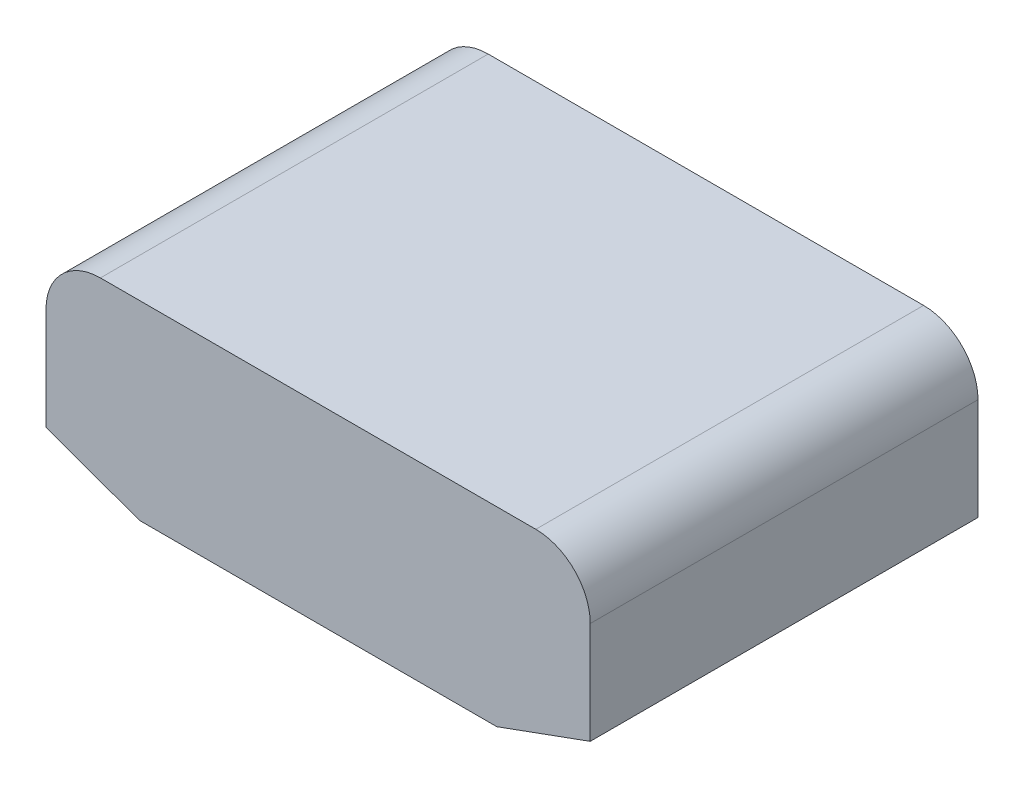
ISO-10303-21;
HEADER;
FILE_DESCRIPTION(('STEP AP214'),'2;1');
FILE_NAME('part.step','',(''),(''),'','','');
FILE_SCHEMA(('AUTOMOTIVE_DESIGN { 1 0 10303 214 1 1 1 1 }'));
ENDSEC;
DATA;
#1=APPLICATION_CONTEXT('core data for automotive mechanical design processes');
#2=APPLICATION_PROTOCOL_DEFINITION('international standard','automotive_design',2000,#1);
#3=PRODUCT_CONTEXT('',#1,'mechanical');
#4=PRODUCT('Part','Part','',(#3));
#5=PRODUCT_RELATED_PRODUCT_CATEGORY('part','',(#4));
#6=PRODUCT_DEFINITION_FORMATION('','',#4);
#7=PRODUCT_DEFINITION_CONTEXT('part definition',#1,'design');
#8=PRODUCT_DEFINITION('design','',#6,#7);
#9=PRODUCT_DEFINITION_SHAPE('','',#8);
#10=(LENGTH_UNIT() NAMED_UNIT(*) SI_UNIT(.MILLI.,.METRE.));
#11=(NAMED_UNIT(*) PLANE_ANGLE_UNIT() SI_UNIT($,.RADIAN.));
#12=(NAMED_UNIT(*) SI_UNIT($,.STERADIAN.) SOLID_ANGLE_UNIT());
#13=UNCERTAINTY_MEASURE_WITH_UNIT(LENGTH_MEASURE(1.E-05),#10,'distance_accuracy_value','');
#14=(GEOMETRIC_REPRESENTATION_CONTEXT(3) GLOBAL_UNCERTAINTY_ASSIGNED_CONTEXT((#13)) GLOBAL_UNIT_ASSIGNED_CONTEXT((#10,
#11,#12)) REPRESENTATION_CONTEXT('',''));
#15=CARTESIAN_POINT('',(0.,0.,0.));
#16=DIRECTION('',(0.,0.,1.));
#17=DIRECTION('',(1.,0.,0.));
#18=AXIS2_PLACEMENT_3D('',#15,#16,#17);
#19=CARTESIAN_POINT('',(0.,2.8,5.7));
#20=DIRECTION('',(0.,1.,0.));
#21=DIRECTION('',(0.,0.,1.));
#22=AXIS2_PLACEMENT_3D('',#19,#20,#21);
#23=PLANE('',#22);
#24=DIRECTION('',(1.,0.,0.));
#25=VECTOR('',#24,1.);
#26=CARTESIAN_POINT('',(0.,2.8,0.));
#27=LINE('',#26,#25);
#28=CARTESIAN_POINT('',(-6.48915328347895,2.8,0.));
#29=VERTEX_POINT('',#28);
#30=CARTESIAN_POINT('',(-0.0891532834789464,2.8,0.));
#31=VERTEX_POINT('',#30);
#32=EDGE_CURVE('E260',#29,#31,#27,.T.);
#33=ORIENTED_EDGE('',*,*,#32,.F.);
#34=DIRECTION('',(0.,0.,-1.));
#35=VECTOR('',#34,1.);
#36=CARTESIAN_POINT('',(-6.48915328347895,2.8,5.7));
#37=LINE('',#36,#35);
#38=CARTESIAN_POINT('',(-6.48915328347895,2.8,5.7));
#39=VERTEX_POINT('',#38);
#40=EDGE_CURVE('E307',#29,#39,#37,.F.);
#41=ORIENTED_EDGE('',*,*,#40,.T.);
#42=DIRECTION('',(1.,0.,0.));
#43=VECTOR('',#42,1.);
#44=CARTESIAN_POINT('',(0.,2.8,5.7));
#45=LINE('',#44,#43);
#46=CARTESIAN_POINT('',(-0.0891532834789464,2.8,5.7));
#47=VERTEX_POINT('',#46);
#48=EDGE_CURVE('E274',#39,#47,#45,.T.);
#49=ORIENTED_EDGE('',*,*,#48,.T.);
#50=DIRECTION('',(0.,0.,-1.));
#51=VECTOR('',#50,1.);
#52=CARTESIAN_POINT('',(-0.0891532834789464,2.8,5.7));
#53=LINE('',#52,#51);
#54=EDGE_CURVE('E304',#47,#31,#53,.T.);
#55=ORIENTED_EDGE('',*,*,#54,.T.);
#56=EDGE_LOOP('',(#33,#41,#49,#55));
#57=FACE_BOUND('',#56,.T.);
#58=ADVANCED_FACE('F34',(#57),#23,.T.);
#59=CARTESIAN_POINT('',(-7.28915328347895,0.,5.7));
#60=DIRECTION('',(1.,0.,0.));
#61=DIRECTION('',(0.,0.,-1.));
#62=AXIS2_PLACEMENT_3D('',#59,#60,#61);
#63=PLANE('',#62);
#64=DIRECTION('',(0.,-1.,0.));
#65=VECTOR('',#64,1.);
#66=CARTESIAN_POINT('',(-7.28915328347895,0.,0.));
#67=LINE('',#66,#65);
#68=CARTESIAN_POINT('',(-7.28915328347895,2.,0.));
#69=VERTEX_POINT('',#68);
#70=CARTESIAN_POINT('',(-7.28915328347895,0.5,0.));
#71=VERTEX_POINT('',#70);
#72=EDGE_CURVE('E290',#69,#71,#67,.T.);
#73=ORIENTED_EDGE('',*,*,#72,.T.);
#74=DIRECTION('',(0.,0.,1.));
#75=VECTOR('',#74,1.);
#76=CARTESIAN_POINT('',(-7.28915328347895,0.5,5.7));
#77=LINE('',#76,#75);
#78=CARTESIAN_POINT('',(-7.28915328347895,0.5,5.7));
#79=VERTEX_POINT('',#78);
#80=EDGE_CURVE('E11',#71,#79,#77,.T.);
#81=ORIENTED_EDGE('',*,*,#80,.T.);
#82=DIRECTION('',(0.,-1.,0.));
#83=VECTOR('',#82,1.);
#84=CARTESIAN_POINT('',(-7.28915328347895,0.,5.7));
#85=LINE('',#84,#83);
#86=CARTESIAN_POINT('',(-7.28915328347895,2.,5.7));
#87=VERTEX_POINT('',#86);
#88=EDGE_CURVE('E277',#87,#79,#85,.T.);
#89=ORIENTED_EDGE('',*,*,#88,.F.);
#90=DIRECTION('',(0.,0.,-1.));
#91=VECTOR('',#90,1.);
#92=CARTESIAN_POINT('',(-7.28915328347895,2.,0.));
#93=LINE('',#92,#91);
#94=EDGE_CURVE('E287',#87,#69,#93,.T.);
#95=ORIENTED_EDGE('',*,*,#94,.T.);
#96=EDGE_LOOP('',(#73,#81,#89,#95));
#97=FACE_BOUND('',#96,.T.);
#98=ADVANCED_FACE('F353',(#97),#63,.F.);
#99=CARTESIAN_POINT('',(0.,0.,5.7));
#100=DIRECTION('',(0.,-1.,0.));
#101=DIRECTION('',(1.,0.,0.));
#102=AXIS2_PLACEMENT_3D('',#99,#100,#101);
#103=PLANE('',#102);
#104=DIRECTION('',(-1.,0.,0.));
#105=VECTOR('',#104,1.);
#106=CARTESIAN_POINT('',(0.,0.,0.));
#107=LINE('',#106,#105);
#108=CARTESIAN_POINT('',(-0.662891993206257,0.,0.));
#109=VERTEX_POINT('',#108);
#110=CARTESIAN_POINT('',(-5.91541457375164,0.,0.));
#111=VERTEX_POINT('',#110);
#112=EDGE_CURVE('E293',#109,#111,#107,.T.);
#113=ORIENTED_EDGE('',*,*,#112,.F.);
#114=DIRECTION('',(0.,0.,1.));
#115=VECTOR('',#114,1.);
#116=CARTESIAN_POINT('',(-0.662891993206257,0.,5.7));
#117=LINE('',#116,#115);
#118=CARTESIAN_POINT('',(-0.662891993206257,0.,5.7));
#119=VERTEX_POINT('',#118);
#120=EDGE_CURVE('E325',#109,#119,#117,.T.);
#121=ORIENTED_EDGE('',*,*,#120,.T.);
#122=DIRECTION('',(-1.,0.,0.));
#123=VECTOR('',#122,1.);
#124=CARTESIAN_POINT('',(0.,0.,5.7));
#125=LINE('',#124,#123);
#126=CARTESIAN_POINT('',(-5.91541457375164,0.,5.7));
#127=VERTEX_POINT('',#126);
#128=EDGE_CURVE('E281',#119,#127,#125,.T.);
#129=ORIENTED_EDGE('',*,*,#128,.T.);
#130=DIRECTION('',(0.,0.,-1.));
#131=VECTOR('',#130,1.);
#132=CARTESIAN_POINT('',(-5.91541457375164,0.,0.));
#133=LINE('',#132,#131);
#134=EDGE_CURVE('E322',#127,#111,#133,.T.);
#135=ORIENTED_EDGE('',*,*,#134,.T.);
#136=EDGE_LOOP('',(#113,#121,#129,#135));
#137=FACE_BOUND('',#136,.T.);
#138=ADVANCED_FACE('F346',(#137),#103,.T.);
#139=CARTESIAN_POINT('',(0.710846716521054,0.,5.7));
#140=DIRECTION('',(1.,0.,0.));
#141=DIRECTION('',(0.,0.,-1.));
#142=AXIS2_PLACEMENT_3D('',#139,#140,#141);
#143=PLANE('',#142);
#144=DIRECTION('',(0.,-1.,0.));
#145=VECTOR('',#144,1.);
#146=CARTESIAN_POINT('',(0.710846716521054,0.,5.7));
#147=LINE('',#146,#145);
#148=CARTESIAN_POINT('',(0.710846716521054,2.,5.7));
#149=VERTEX_POINT('',#148);
#150=CARTESIAN_POINT('',(0.710846716521054,0.500000000000002,5.7));
#151=VERTEX_POINT('',#150);
#152=EDGE_CURVE('E284',#149,#151,#147,.T.);
#153=ORIENTED_EDGE('',*,*,#152,.T.);
#154=DIRECTION('',(0.,0.,-1.));
#155=VECTOR('',#154,1.);
#156=CARTESIAN_POINT('',(0.710846716521054,0.500000000000002,5.7));
#157=LINE('',#156,#155);
#158=CARTESIAN_POINT('',(0.710846716521054,0.500000000000002,0.));
#159=VERTEX_POINT('',#158);
#160=EDGE_CURVE('E315',#151,#159,#157,.T.);
#161=ORIENTED_EDGE('',*,*,#160,.T.);
#162=DIRECTION('',(0.,-1.,0.));
#163=VECTOR('',#162,1.);
#164=CARTESIAN_POINT('',(0.710846716521054,0.,0.));
#165=LINE('',#164,#163);
#166=CARTESIAN_POINT('',(0.710846716521054,2.,0.));
#167=VERTEX_POINT('',#166);
#168=EDGE_CURVE('E278',#167,#159,#165,.T.);
#169=ORIENTED_EDGE('',*,*,#168,.F.);
#170=DIRECTION('',(0.,0.,-1.));
#171=VECTOR('',#170,1.);
#172=CARTESIAN_POINT('',(0.710846716521054,2.,5.7));
#173=LINE('',#172,#171);
#174=EDGE_CURVE('E313',#167,#149,#173,.F.);
#175=ORIENTED_EDGE('',*,*,#174,.T.);
#176=EDGE_LOOP('',(#153,#161,#169,#175));
#177=FACE_BOUND('',#176,.T.);
#178=ADVANCED_FACE('F338',(#177),#143,.T.);
#179=CARTESIAN_POINT('',(0.,0.,5.7));
#180=DIRECTION('',(0.,0.,1.));
#181=DIRECTION('',(1.,0.,0.));
#182=AXIS2_PLACEMENT_3D('',#179,#180,#181);
#183=PLANE('',#182);
#184=ORIENTED_EDGE('',*,*,#128,.F.);
#185=DIRECTION('',(-0.939692620785908,-0.34202014332567,0.));
#186=VECTOR('',#185,1.);
#187=CARTESIAN_POINT('',(-0.0775436327112707,0.213049379896698,5.7));
#188=LINE('',#187,#186);
#189=EDGE_CURVE('E42',#119,#151,#188,.F.);
#190=ORIENTED_EDGE('',*,*,#189,.T.);
#191=ORIENTED_EDGE('',*,*,#152,.F.);
#192=CARTESIAN_POINT('',(-0.0891532834789464,2.,5.7));
#193=DIRECTION('',(0.,0.,1.));
#194=DIRECTION('',(1.,0.,0.));
#195=AXIS2_PLACEMENT_3D('',#192,#193,#194);
#196=CIRCLE('',#195,0.8);
#197=EDGE_CURVE('E309',#149,#47,#196,.T.);
#198=ORIENTED_EDGE('',*,*,#197,.T.);
#199=ORIENTED_EDGE('',*,*,#48,.F.);
#200=CARTESIAN_POINT('',(-6.48915328347895,2.,5.7));
#201=DIRECTION('',(0.,0.,1.));
#202=DIRECTION('',(1.,0.,0.));
#203=AXIS2_PLACEMENT_3D('',#200,#201,#202);
#204=CIRCLE('',#203,0.8);
#205=EDGE_CURVE('E311',#39,#87,#204,.T.);
#206=ORIENTED_EDGE('',*,*,#205,.T.);
#207=ORIENTED_EDGE('',*,*,#88,.T.);
#208=DIRECTION('',(0.939692620785908,-0.342020143325669,0.));
#209=VECTOR('',#208,1.);
#210=CARTESIAN_POINT('',(-0.691972055392091,-1.90117759708337,5.7));
#211=LINE('',#210,#209);
#212=EDGE_CURVE('E327',#79,#127,#211,.T.);
#213=ORIENTED_EDGE('',*,*,#212,.T.);
#214=EDGE_LOOP('',(#184,#190,#191,#198,#199,#206,#207,#213));
#215=FACE_BOUND('',#214,.T.);
#216=ADVANCED_FACE('F332',(#215),#183,.T.);
#217=CARTESIAN_POINT('',(0.,0.,0.));
#218=DIRECTION('',(0.,0.,1.));
#219=DIRECTION('',(1.,0.,0.));
#220=AXIS2_PLACEMENT_3D('',#217,#218,#219);
#221=PLANE('',#220);
#222=DIRECTION('',(0.,-1.,0.));
#223=VECTOR('',#222,1.);
#224=CARTESIAN_POINT('',(0.310846716521054,2.,0.));
#225=LINE('',#224,#223);
#226=CARTESIAN_POINT('',(0.310846716521054,2.,0.));
#227=VERTEX_POINT('',#226);
#228=CARTESIAN_POINT('',(0.310846716521054,0.780083015283885,0.));
#229=VERTEX_POINT('',#228);
#230=EDGE_CURVE('E238',#227,#229,#225,.T.);
#231=ORIENTED_EDGE('',*,*,#230,.F.);
#232=CARTESIAN_POINT('',(-0.0891532834789464,2.,0.));
#233=DIRECTION('',(0.,0.,-1.));
#234=DIRECTION('',(-1.,0.,0.));
#235=AXIS2_PLACEMENT_3D('',#232,#233,#234);
#236=CIRCLE('',#235,0.4);
#237=CARTESIAN_POINT('',(-0.0891532834789485,2.4,0.));
#238=VERTEX_POINT('',#237);
#239=EDGE_CURVE('E49',#238,#227,#236,.T.);
#240=ORIENTED_EDGE('',*,*,#239,.F.);
#241=DIRECTION('',(1.,0.,0.));
#242=VECTOR('',#241,1.);
#243=CARTESIAN_POINT('',(-6.48915328347895,2.4,0.));
#244=LINE('',#243,#242);
#245=CARTESIAN_POINT('',(-6.48915328347895,2.4,0.));
#246=VERTEX_POINT('',#245);
#247=EDGE_CURVE('E215',#246,#238,#244,.T.);
#248=ORIENTED_EDGE('',*,*,#247,.F.);
#249=CARTESIAN_POINT('',(-6.48915328347895,2.,0.));
#250=DIRECTION('',(0.,0.,-1.));
#251=DIRECTION('',(-1.,0.,0.));
#252=AXIS2_PLACEMENT_3D('',#249,#250,#251);
#253=CIRCLE('',#252,0.4);
#254=CARTESIAN_POINT('',(-6.88915328347895,2.,0.));
#255=VERTEX_POINT('',#254);
#256=EDGE_CURVE('E253',#255,#246,#253,.T.);
#257=ORIENTED_EDGE('',*,*,#256,.F.);
#258=DIRECTION('',(0.,1.,0.));
#259=VECTOR('',#258,1.);
#260=CARTESIAN_POINT('',(-6.88915328347895,0.780083015283883,0.));
#261=LINE('',#260,#259);
#262=CARTESIAN_POINT('',(-6.88915328347895,0.780083015283883,0.));
#263=VERTEX_POINT('',#262);
#264=EDGE_CURVE('E250',#263,#255,#261,.T.);
#265=ORIENTED_EDGE('',*,*,#264,.F.);
#266=DIRECTION('',(-0.939692620785908,0.342020143325669,0.));
#267=VECTOR('',#266,1.);
#268=CARTESIAN_POINT('',(-5.84488378146825,0.399999999999999,0.));
#269=LINE('',#268,#267);
#270=CARTESIAN_POINT('',(-5.84488378146825,0.399999999999999,0.));
#271=VERTEX_POINT('',#270);
#272=EDGE_CURVE('E247',#271,#263,#269,.T.);
#273=ORIENTED_EDGE('',*,*,#272,.F.);
#274=DIRECTION('',(-1.,0.,0.));
#275=VECTOR('',#274,1.);
#276=CARTESIAN_POINT('',(-0.733422785489644,0.4,0.));
#277=LINE('',#276,#275);
#278=CARTESIAN_POINT('',(-0.733422785489644,0.4,0.));
#279=VERTEX_POINT('',#278);
#280=EDGE_CURVE('E244',#279,#271,#277,.T.);
#281=ORIENTED_EDGE('',*,*,#280,.F.);
#282=DIRECTION('',(-0.939692620785908,-0.34202014332567,0.));
#283=VECTOR('',#282,1.);
#284=CARTESIAN_POINT('',(0.310846716521054,0.780083015283885,0.));
#285=LINE('',#284,#283);
#286=EDGE_CURVE('E241',#229,#279,#285,.T.);
#287=ORIENTED_EDGE('',*,*,#286,.F.);
#288=EDGE_LOOP('',(#231,#240,#248,#257,#265,#273,#281,#287));
#289=FACE_BOUND('',#288,.T.);
#290=ORIENTED_EDGE('',*,*,#168,.T.);
#291=DIRECTION('',(0.939692620785908,0.34202014332567,0.));
#292=VECTOR('',#291,1.);
#293=CARTESIAN_POINT('',(0.710846716521054,0.500000000000002,0.));
#294=LINE('',#293,#292);
#295=EDGE_CURVE('E320',#159,#109,#294,.F.);
#296=ORIENTED_EDGE('',*,*,#295,.T.);
#297=ORIENTED_EDGE('',*,*,#112,.T.);
#298=DIRECTION('',(-0.939692620785908,0.342020143325669,0.));
#299=VECTOR('',#298,1.);
#300=CARTESIAN_POINT('',(-5.91541457375164,0.,0.));
#301=LINE('',#300,#299);
#302=EDGE_CURVE('E318',#111,#71,#301,.T.);
#303=ORIENTED_EDGE('',*,*,#302,.T.);
#304=ORIENTED_EDGE('',*,*,#72,.F.);
#305=CARTESIAN_POINT('',(-6.48915328347895,2.,0.));
#306=DIRECTION('',(0.,0.,1.));
#307=DIRECTION('',(1.,0.,0.));
#308=AXIS2_PLACEMENT_3D('',#305,#306,#307);
#309=CIRCLE('',#308,0.8);
#310=EDGE_CURVE('E302',#69,#29,#309,.F.);
#311=ORIENTED_EDGE('',*,*,#310,.T.);
#312=ORIENTED_EDGE('',*,*,#32,.T.);
#313=CARTESIAN_POINT('',(-0.0891532834789464,2.,0.));
#314=DIRECTION('',(0.,0.,1.));
#315=DIRECTION('',(1.,0.,0.));
#316=AXIS2_PLACEMENT_3D('',#313,#314,#315);
#317=CIRCLE('',#316,0.8);
#318=EDGE_CURVE('E300',#31,#167,#317,.F.);
#319=ORIENTED_EDGE('',*,*,#318,.T.);
#320=EDGE_LOOP('',(#290,#296,#297,#303,#304,#311,#312,#319));
#321=FACE_BOUND('',#320,.T.);
#322=ADVANCED_FACE('F344',(#289,#321),#221,.F.);
#323=CARTESIAN_POINT('',(-6.48915328347895,2.,5.7));
#324=DIRECTION('',(0.,0.,1.));
#325=DIRECTION('',(1.,0.,0.));
#326=AXIS2_PLACEMENT_3D('',#323,#324,#325);
#327=CYLINDRICAL_SURFACE('',#326,0.8);
#328=ORIENTED_EDGE('',*,*,#205,.F.);
#329=ORIENTED_EDGE('',*,*,#40,.F.);
#330=ORIENTED_EDGE('',*,*,#310,.F.);
#331=ORIENTED_EDGE('',*,*,#94,.F.);
#332=EDGE_LOOP('',(#328,#329,#330,#331));
#333=FACE_BOUND('',#332,.T.);
#334=ADVANCED_FACE('F358',(#333),#327,.T.);
#335=CARTESIAN_POINT('',(-0.0891532834789464,2.,5.7));
#336=DIRECTION('',(0.,0.,-1.));
#337=DIRECTION('',(-1.,0.,0.));
#338=AXIS2_PLACEMENT_3D('',#335,#336,#337);
#339=CYLINDRICAL_SURFACE('',#338,0.8);
#340=ORIENTED_EDGE('',*,*,#197,.F.);
#341=ORIENTED_EDGE('',*,*,#174,.F.);
#342=ORIENTED_EDGE('',*,*,#318,.F.);
#343=ORIENTED_EDGE('',*,*,#54,.F.);
#344=EDGE_LOOP('',(#340,#341,#342,#343));
#345=FACE_BOUND('',#344,.T.);
#346=ADVANCED_FACE('F365',(#345),#339,.T.);
#347=CARTESIAN_POINT('',(0.710846716521054,0.500000000000002,5.7));
#348=DIRECTION('',(-0.34202014332567,0.939692620785908,0.));
#349=DIRECTION('',(0.,0.,-1.));
#350=AXIS2_PLACEMENT_3D('',#347,#348,#349);
#351=PLANE('',#350);
#352=ORIENTED_EDGE('',*,*,#189,.F.);
#353=ORIENTED_EDGE('',*,*,#120,.F.);
#354=ORIENTED_EDGE('',*,*,#295,.F.);
#355=ORIENTED_EDGE('',*,*,#160,.F.);
#356=EDGE_LOOP('',(#352,#353,#354,#355));
#357=FACE_BOUND('',#356,.T.);
#358=ADVANCED_FACE('F341',(#357),#351,.F.);
#359=CARTESIAN_POINT('',(-5.91541457375164,0.,5.7));
#360=DIRECTION('',(-0.342020143325669,-0.939692620785908,0.));
#361=DIRECTION('',(0.,0.,1.));
#362=AXIS2_PLACEMENT_3D('',#359,#360,#361);
#363=PLANE('',#362);
#364=ORIENTED_EDGE('',*,*,#212,.F.);
#365=ORIENTED_EDGE('',*,*,#80,.F.);
#366=ORIENTED_EDGE('',*,*,#302,.F.);
#367=ORIENTED_EDGE('',*,*,#134,.F.);
#368=EDGE_LOOP('',(#364,#365,#366,#367));
#369=FACE_BOUND('',#368,.T.);
#370=ADVANCED_FACE('F36',(#369),#363,.T.);
#371=CARTESIAN_POINT('',(-0.0891532834789464,2.,5.));
#372=DIRECTION('',(0.,0.,-1.));
#373=DIRECTION('',(-1.,0.,0.));
#374=AXIS2_PLACEMENT_3D('',#371,#372,#373);
#375=CYLINDRICAL_SURFACE('',#374,0.4);
#376=ORIENTED_EDGE('',*,*,#239,.T.);
#377=DIRECTION('',(0.,0.,-1.));
#378=VECTOR('',#377,1.);
#379=CARTESIAN_POINT('',(0.310846716521054,2.,5.));
#380=LINE('',#379,#378);
#381=CARTESIAN_POINT('',(0.310846716521054,2.,5.));
#382=VERTEX_POINT('',#381);
#383=EDGE_CURVE('E236',#382,#227,#380,.T.);
#384=ORIENTED_EDGE('',*,*,#383,.F.);
#385=CARTESIAN_POINT('',(-0.0891532834789464,2.,5.));
#386=DIRECTION('',(0.,0.,-1.));
#387=DIRECTION('',(-1.,0.,0.));
#388=AXIS2_PLACEMENT_3D('',#385,#386,#387);
#389=CIRCLE('',#388,0.4);
#390=CARTESIAN_POINT('',(-0.0891532834789485,2.4,5.));
#391=VERTEX_POINT('',#390);
#392=EDGE_CURVE('E211',#391,#382,#389,.T.);
#393=ORIENTED_EDGE('',*,*,#392,.F.);
#394=DIRECTION('',(0.,0.,-1.));
#395=VECTOR('',#394,1.);
#396=CARTESIAN_POINT('',(-0.0891532834789485,2.4,5.));
#397=LINE('',#396,#395);
#398=EDGE_CURVE('E258',#391,#238,#397,.T.);
#399=ORIENTED_EDGE('',*,*,#398,.T.);
#400=EDGE_LOOP('',(#376,#384,#393,#399));
#401=FACE_BOUND('',#400,.T.);
#402=ADVANCED_FACE('F390',(#401),#375,.F.);
#403=CARTESIAN_POINT('',(-6.48915328347895,2.4,5.));
#404=DIRECTION('',(0.,1.,0.));
#405=DIRECTION('',(0.,0.,1.));
#406=AXIS2_PLACEMENT_3D('',#403,#404,#405);
#407=PLANE('',#406);
#408=ORIENTED_EDGE('',*,*,#247,.T.);
#409=ORIENTED_EDGE('',*,*,#398,.F.);
#410=DIRECTION('',(1.,0.,0.));
#411=VECTOR('',#410,1.);
#412=CARTESIAN_POINT('',(-6.48915328347895,2.4,5.));
#413=LINE('',#412,#411);
#414=CARTESIAN_POINT('',(-6.48915328347895,2.4,5.));
#415=VERTEX_POINT('',#414);
#416=EDGE_CURVE('E233',#415,#391,#413,.T.);
#417=ORIENTED_EDGE('',*,*,#416,.F.);
#418=DIRECTION('',(0.,0.,-1.));
#419=VECTOR('',#418,1.);
#420=CARTESIAN_POINT('',(-6.48915328347895,2.4,5.));
#421=LINE('',#420,#419);
#422=EDGE_CURVE('E261',#415,#246,#421,.T.);
#423=ORIENTED_EDGE('',*,*,#422,.T.);
#424=EDGE_LOOP('',(#408,#409,#417,#423));
#425=FACE_BOUND('',#424,.T.);
#426=ADVANCED_FACE('F393',(#425),#407,.F.);
#427=CARTESIAN_POINT('',(-6.48915328347895,2.,5.));
#428=DIRECTION('',(0.,0.,-1.));
#429=DIRECTION('',(-1.,0.,0.));
#430=AXIS2_PLACEMENT_3D('',#427,#428,#429);
#431=CYLINDRICAL_SURFACE('',#430,0.4);
#432=ORIENTED_EDGE('',*,*,#256,.T.);
#433=ORIENTED_EDGE('',*,*,#422,.F.);
#434=CARTESIAN_POINT('',(-6.48915328347895,2.,5.));
#435=DIRECTION('',(0.,0.,-1.));
#436=DIRECTION('',(-1.,0.,0.));
#437=AXIS2_PLACEMENT_3D('',#434,#435,#436);
#438=CIRCLE('',#437,0.4);
#439=CARTESIAN_POINT('',(-6.88915328347895,2.,5.));
#440=VERTEX_POINT('',#439);
#441=EDGE_CURVE('E230',#440,#415,#438,.T.);
#442=ORIENTED_EDGE('',*,*,#441,.F.);
#443=DIRECTION('',(0.,0.,-1.));
#444=VECTOR('',#443,1.);
#445=CARTESIAN_POINT('',(-6.88915328347895,2.,5.));
#446=LINE('',#445,#444);
#447=EDGE_CURVE('E263',#440,#255,#446,.T.);
#448=ORIENTED_EDGE('',*,*,#447,.T.);
#449=EDGE_LOOP('',(#432,#433,#442,#448));
#450=FACE_BOUND('',#449,.T.);
#451=ADVANCED_FACE('F413',(#450),#431,.F.);
#452=CARTESIAN_POINT('',(-6.88915328347895,0.780083015283883,5.));
#453=DIRECTION('',(-1.,0.,0.));
#454=DIRECTION('',(0.,0.,1.));
#455=AXIS2_PLACEMENT_3D('',#452,#453,#454);
#456=PLANE('',#455);
#457=ORIENTED_EDGE('',*,*,#264,.T.);
#458=ORIENTED_EDGE('',*,*,#447,.F.);
#459=DIRECTION('',(0.,1.,0.));
#460=VECTOR('',#459,1.);
#461=CARTESIAN_POINT('',(-6.88915328347895,0.780083015283883,5.));
#462=LINE('',#461,#460);
#463=CARTESIAN_POINT('',(-6.88915328347895,0.780083015283883,5.));
#464=VERTEX_POINT('',#463);
#465=EDGE_CURVE('E227',#464,#440,#462,.T.);
#466=ORIENTED_EDGE('',*,*,#465,.F.);
#467=DIRECTION('',(0.,0.,-1.));
#468=VECTOR('',#467,1.);
#469=CARTESIAN_POINT('',(-6.88915328347895,0.780083015283883,5.));
#470=LINE('',#469,#468);
#471=EDGE_CURVE('E265',#464,#263,#470,.T.);
#472=ORIENTED_EDGE('',*,*,#471,.T.);
#473=EDGE_LOOP('',(#457,#458,#466,#472));
#474=FACE_BOUND('',#473,.T.);
#475=ADVANCED_FACE('F409',(#474),#456,.F.);
#476=CARTESIAN_POINT('',(-5.84488378146825,0.399999999999999,5.));
#477=DIRECTION('',(-0.342020143325669,-0.939692620785908,0.));
#478=DIRECTION('',(0.939692620785908,-0.342020143325669,0.));
#479=AXIS2_PLACEMENT_3D('',#476,#477,#478);
#480=PLANE('',#479);
#481=ORIENTED_EDGE('',*,*,#272,.T.);
#482=ORIENTED_EDGE('',*,*,#471,.F.);
#483=DIRECTION('',(-0.939692620785908,0.342020143325669,0.));
#484=VECTOR('',#483,1.);
#485=CARTESIAN_POINT('',(-5.84488378146825,0.399999999999999,5.));
#486=LINE('',#485,#484);
#487=CARTESIAN_POINT('',(-5.84488378146825,0.399999999999999,5.));
#488=VERTEX_POINT('',#487);
#489=EDGE_CURVE('E224',#488,#464,#486,.T.);
#490=ORIENTED_EDGE('',*,*,#489,.F.);
#491=DIRECTION('',(0.,0.,-1.));
#492=VECTOR('',#491,1.);
#493=CARTESIAN_POINT('',(-5.84488378146825,0.399999999999999,5.));
#494=LINE('',#493,#492);
#495=EDGE_CURVE('E267',#488,#271,#494,.T.);
#496=ORIENTED_EDGE('',*,*,#495,.T.);
#497=EDGE_LOOP('',(#481,#482,#490,#496));
#498=FACE_BOUND('',#497,.T.);
#499=ADVANCED_FACE('F405',(#498),#480,.F.);
#500=CARTESIAN_POINT('',(-0.733422785489644,0.4,5.));
#501=DIRECTION('',(0.,-1.,0.));
#502=DIRECTION('',(1.,0.,0.));
#503=AXIS2_PLACEMENT_3D('',#500,#501,#502);
#504=PLANE('',#503);
#505=ORIENTED_EDGE('',*,*,#280,.T.);
#506=ORIENTED_EDGE('',*,*,#495,.F.);
#507=DIRECTION('',(-1.,0.,0.));
#508=VECTOR('',#507,1.);
#509=CARTESIAN_POINT('',(-0.733422785489644,0.4,5.));
#510=LINE('',#509,#508);
#511=CARTESIAN_POINT('',(-0.733422785489644,0.4,5.));
#512=VERTEX_POINT('',#511);
#513=EDGE_CURVE('E221',#512,#488,#510,.T.);
#514=ORIENTED_EDGE('',*,*,#513,.F.);
#515=DIRECTION('',(0.,0.,-1.));
#516=VECTOR('',#515,1.);
#517=CARTESIAN_POINT('',(-0.733422785489644,0.4,5.));
#518=LINE('',#517,#516);
#519=EDGE_CURVE('E269',#512,#279,#518,.T.);
#520=ORIENTED_EDGE('',*,*,#519,.T.);
#521=EDGE_LOOP('',(#505,#506,#514,#520));
#522=FACE_BOUND('',#521,.T.);
#523=ADVANCED_FACE('F401',(#522),#504,.F.);
#524=CARTESIAN_POINT('',(0.310846716521054,0.780083015283885,5.));
#525=DIRECTION('',(0.34202014332567,-0.939692620785908,0.));
#526=DIRECTION('',(0.939692620785908,0.34202014332567,0.));
#527=AXIS2_PLACEMENT_3D('',#524,#525,#526);
#528=PLANE('',#527);
#529=ORIENTED_EDGE('',*,*,#286,.T.);
#530=ORIENTED_EDGE('',*,*,#519,.F.);
#531=DIRECTION('',(-0.939692620785908,-0.34202014332567,0.));
#532=VECTOR('',#531,1.);
#533=CARTESIAN_POINT('',(0.310846716521054,0.780083015283885,5.));
#534=LINE('',#533,#532);
#535=CARTESIAN_POINT('',(0.310846716521054,0.780083015283885,5.));
#536=VERTEX_POINT('',#535);
#537=EDGE_CURVE('E218',#536,#512,#534,.T.);
#538=ORIENTED_EDGE('',*,*,#537,.F.);
#539=DIRECTION('',(0.,0.,-1.));
#540=VECTOR('',#539,1.);
#541=CARTESIAN_POINT('',(0.310846716521054,0.780083015283885,5.));
#542=LINE('',#541,#540);
#543=EDGE_CURVE('E271',#536,#229,#542,.T.);
#544=ORIENTED_EDGE('',*,*,#543,.T.);
#545=EDGE_LOOP('',(#529,#530,#538,#544));
#546=FACE_BOUND('',#545,.T.);
#547=ADVANCED_FACE('F397',(#546),#528,.F.);
#548=CARTESIAN_POINT('',(0.310846716521054,2.,5.));
#549=DIRECTION('',(1.,0.,0.));
#550=DIRECTION('',(0.,0.,-1.));
#551=AXIS2_PLACEMENT_3D('',#548,#549,#550);
#552=PLANE('',#551);
#553=ORIENTED_EDGE('',*,*,#230,.T.);
#554=ORIENTED_EDGE('',*,*,#543,.F.);
#555=DIRECTION('',(0.,-1.,0.));
#556=VECTOR('',#555,1.);
#557=CARTESIAN_POINT('',(0.310846716521054,2.,5.));
#558=LINE('',#557,#556);
#559=EDGE_CURVE('E214',#382,#536,#558,.T.);
#560=ORIENTED_EDGE('',*,*,#559,.F.);
#561=ORIENTED_EDGE('',*,*,#383,.T.);
#562=EDGE_LOOP('',(#553,#554,#560,#561));
#563=FACE_BOUND('',#562,.T.);
#564=ADVANCED_FACE('F394',(#563),#552,.F.);
#565=CARTESIAN_POINT('',(-0.0891532834789464,2.,5.));
#566=DIRECTION('',(0.,0.,-1.));
#567=DIRECTION('',(-1.,0.,0.));
#568=AXIS2_PLACEMENT_3D('',#565,#566,#567);
#569=PLANE('',#568);
#570=DIRECTION('',(-1.,0.,0.));
#571=VECTOR('',#570,1.);
#572=CARTESIAN_POINT('',(-5.84488378146825,1.11944980492851,5.));
#573=LINE('',#572,#571);
#574=CARTESIAN_POINT('',(-1.14398976985797,1.11944980492851,5.));
#575=VERTEX_POINT('',#574);
#576=CARTESIAN_POINT('',(-5.84488378146825,1.11944980492851,5.));
#577=VERTEX_POINT('',#576);
#578=EDGE_CURVE('E182',#575,#577,#573,.T.);
#579=ORIENTED_EDGE('',*,*,#578,.F.);
#580=DIRECTION('',(0.,-1.,0.));
#581=VECTOR('',#580,1.);
#582=CARTESIAN_POINT('',(-1.14398976985797,1.73122073521448,5.));
#583=LINE('',#582,#581);
#584=CARTESIAN_POINT('',(-1.14398976985797,1.73122073521448,5.));
#585=VERTEX_POINT('',#584);
#586=EDGE_CURVE('E192',#585,#575,#583,.T.);
#587=ORIENTED_EDGE('',*,*,#586,.F.);
#588=DIRECTION('',(1.,0.,0.));
#589=VECTOR('',#588,1.);
#590=CARTESIAN_POINT('',(-5.84488378146825,1.73122073521448,5.));
#591=LINE('',#590,#589);
#592=CARTESIAN_POINT('',(-5.84488378146825,1.73122073521448,5.));
#593=VERTEX_POINT('',#592);
#594=EDGE_CURVE('E174',#593,#585,#591,.T.);
#595=ORIENTED_EDGE('',*,*,#594,.F.);
#596=DIRECTION('',(0.,1.,0.));
#597=VECTOR('',#596,1.);
#598=CARTESIAN_POINT('',(-5.84488378146825,1.73122073521448,5.));
#599=LINE('',#598,#597);
#600=EDGE_CURVE('E189',#577,#593,#599,.T.);
#601=ORIENTED_EDGE('',*,*,#600,.F.);
#602=EDGE_LOOP('',(#579,#587,#595,#601));
#603=FACE_BOUND('',#602,.T.);
#604=ORIENTED_EDGE('',*,*,#392,.T.);
#605=ORIENTED_EDGE('',*,*,#559,.T.);
#606=ORIENTED_EDGE('',*,*,#537,.T.);
#607=ORIENTED_EDGE('',*,*,#513,.T.);
#608=ORIENTED_EDGE('',*,*,#489,.T.);
#609=ORIENTED_EDGE('',*,*,#465,.T.);
#610=ORIENTED_EDGE('',*,*,#441,.T.);
#611=ORIENTED_EDGE('',*,*,#416,.T.);
#612=EDGE_LOOP('',(#604,#605,#606,#607,#608,#609,#610,#611));
#613=FACE_BOUND('',#612,.T.);
#614=ADVANCED_FACE('F187',(#603,#613),#569,.T.);
#615=CARTESIAN_POINT('',(-5.84488378146825,1.73122073521448,5.));
#616=DIRECTION('',(-1.,0.,0.));
#617=DIRECTION('',(0.,0.,1.));
#618=AXIS2_PLACEMENT_3D('',#615,#616,#617);
#619=PLANE('',#618);
#620=DIRECTION('',(0.,1.,0.));
#621=VECTOR('',#620,1.);
#622=CARTESIAN_POINT('',(-5.84488378146825,1.73122073521448,0.));
#623=LINE('',#622,#621);
#624=CARTESIAN_POINT('',(-5.84488378146825,1.11944980492851,0.));
#625=VERTEX_POINT('',#624);
#626=CARTESIAN_POINT('',(-5.84488378146825,1.73122073521448,0.));
#627=VERTEX_POINT('',#626);
#628=EDGE_CURVE('E203',#625,#627,#623,.T.);
#629=ORIENTED_EDGE('',*,*,#628,.F.);
#630=DIRECTION('',(0.,0.,-1.));
#631=VECTOR('',#630,1.);
#632=CARTESIAN_POINT('',(-5.84488378146825,1.11944980492851,5.));
#633=LINE('',#632,#631);
#634=EDGE_CURVE('E195',#577,#625,#633,.T.);
#635=ORIENTED_EDGE('',*,*,#634,.F.);
#636=ORIENTED_EDGE('',*,*,#600,.T.);
#637=DIRECTION('',(0.,0.,-1.));
#638=VECTOR('',#637,1.);
#639=CARTESIAN_POINT('',(-5.84488378146825,1.73122073521448,5.));
#640=LINE('',#639,#638);
#641=EDGE_CURVE('E171',#593,#627,#640,.T.);
#642=ORIENTED_EDGE('',*,*,#641,.T.);
#643=EDGE_LOOP('',(#629,#635,#636,#642));
#644=FACE_BOUND('',#643,.T.);
#645=ADVANCED_FACE('F194',(#644),#619,.T.);
#646=CARTESIAN_POINT('',(-5.84488378146825,1.11944980492851,5.));
#647=DIRECTION('',(0.,-1.,0.));
#648=DIRECTION('',(0.,0.,-1.));
#649=AXIS2_PLACEMENT_3D('',#646,#647,#648);
#650=PLANE('',#649);
#651=DIRECTION('',(-1.,0.,0.));
#652=VECTOR('',#651,1.);
#653=CARTESIAN_POINT('',(-5.84488378146825,1.11944980492851,0.));
#654=LINE('',#653,#652);
#655=CARTESIAN_POINT('',(-1.14398976985797,1.11944980492851,0.));
#656=VERTEX_POINT('',#655);
#657=EDGE_CURVE('E196',#656,#625,#654,.T.);
#658=ORIENTED_EDGE('',*,*,#657,.F.);
#659=DIRECTION('',(0.,0.,-1.));
#660=VECTOR('',#659,1.);
#661=CARTESIAN_POINT('',(-1.14398976985797,1.11944980492851,5.));
#662=LINE('',#661,#660);
#663=EDGE_CURVE('E208',#575,#656,#662,.T.);
#664=ORIENTED_EDGE('',*,*,#663,.F.);
#665=ORIENTED_EDGE('',*,*,#578,.T.);
#666=ORIENTED_EDGE('',*,*,#634,.T.);
#667=EDGE_LOOP('',(#658,#664,#665,#666));
#668=FACE_BOUND('',#667,.T.);
#669=ADVANCED_FACE('F425',(#668),#650,.T.);
#670=CARTESIAN_POINT('',(-1.14398976985797,1.73122073521448,5.));
#671=DIRECTION('',(1.,0.,0.));
#672=DIRECTION('',(0.,0.,-1.));
#673=AXIS2_PLACEMENT_3D('',#670,#671,#672);
#674=PLANE('',#673);
#675=DIRECTION('',(0.,-1.,0.));
#676=VECTOR('',#675,1.);
#677=CARTESIAN_POINT('',(-1.14398976985797,1.73122073521448,0.));
#678=LINE('',#677,#676);
#679=CARTESIAN_POINT('',(-1.14398976985797,1.73122073521448,0.));
#680=VERTEX_POINT('',#679);
#681=EDGE_CURVE('E57',#680,#656,#678,.T.);
#682=ORIENTED_EDGE('',*,*,#681,.F.);
#683=DIRECTION('',(0.,0.,-1.));
#684=VECTOR('',#683,1.);
#685=CARTESIAN_POINT('',(-1.14398976985797,1.73122073521448,5.));
#686=LINE('',#685,#684);
#687=EDGE_CURVE('E181',#585,#680,#686,.T.);
#688=ORIENTED_EDGE('',*,*,#687,.F.);
#689=ORIENTED_EDGE('',*,*,#586,.T.);
#690=ORIENTED_EDGE('',*,*,#663,.T.);
#691=EDGE_LOOP('',(#682,#688,#689,#690));
#692=FACE_BOUND('',#691,.T.);
#693=ADVANCED_FACE('F428',(#692),#674,.T.);
#694=CARTESIAN_POINT('',(-5.84488378146825,1.73122073521448,5.));
#695=DIRECTION('',(0.,1.,0.));
#696=DIRECTION('',(0.,0.,1.));
#697=AXIS2_PLACEMENT_3D('',#694,#695,#696);
#698=PLANE('',#697);
#699=DIRECTION('',(1.,0.,0.));
#700=VECTOR('',#699,1.);
#701=CARTESIAN_POINT('',(-5.84488378146825,1.73122073521448,0.));
#702=LINE('',#701,#700);
#703=EDGE_CURVE('E176',#627,#680,#702,.T.);
#704=ORIENTED_EDGE('',*,*,#703,.F.);
#705=ORIENTED_EDGE('',*,*,#641,.F.);
#706=ORIENTED_EDGE('',*,*,#594,.T.);
#707=ORIENTED_EDGE('',*,*,#687,.T.);
#708=EDGE_LOOP('',(#704,#705,#706,#707));
#709=FACE_BOUND('',#708,.T.);
#710=ADVANCED_FACE('F173',(#709),#698,.T.);
#711=ORIENTED_EDGE('',*,*,#628,.T.);
#712=ORIENTED_EDGE('',*,*,#703,.T.);
#713=ORIENTED_EDGE('',*,*,#681,.T.);
#714=ORIENTED_EDGE('',*,*,#657,.T.);
#715=EDGE_LOOP('',(#711,#712,#713,#714));
#716=FACE_BOUND('',#715,.T.);
#717=ADVANCED_FACE('F387',(#716),#221,.F.);
#718=CLOSED_SHELL('',(#58,#98,#138,#178,#216,#322,#334,#346,#358,#370,#402,#426,#451,#475,#499,
#523,#547,#564,#614,#645,#669,#693,#710,#717));
#719=MANIFOLD_SOLID_BREP('B2',#718);
#720=ADVANCED_BREP_SHAPE_REPRESENTATION('',(#18,#719),#14);
#721=SHAPE_DEFINITION_REPRESENTATION(#9,#720);
ENDSEC;
END-ISO-10303-21;
